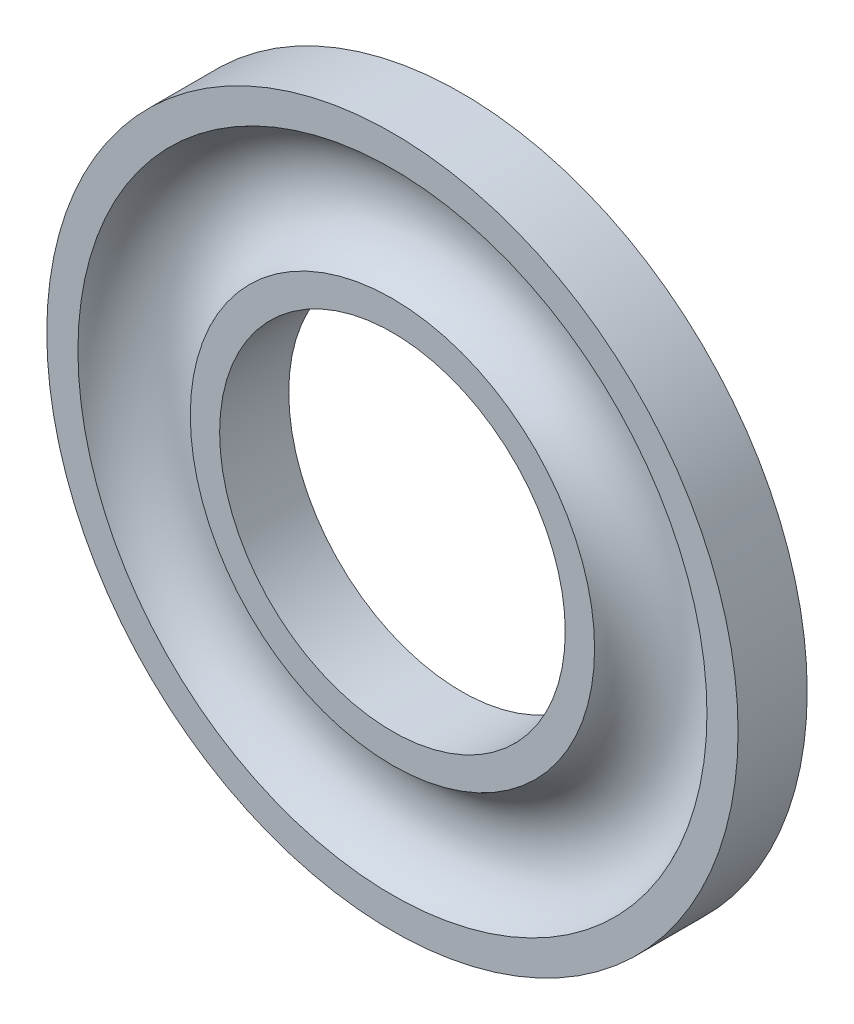
ISO-10303-21;
HEADER;
FILE_DESCRIPTION(('STEP AP214'),'2;1');
FILE_NAME('part.step','',(''),(''),'','','');
FILE_SCHEMA(('AUTOMOTIVE_DESIGN { 1 0 10303 214 1 1 1 1 }'));
ENDSEC;
DATA;
#1=APPLICATION_CONTEXT('core data for automotive mechanical design processes');
#2=APPLICATION_PROTOCOL_DEFINITION('international standard','automotive_design',2000,#1);
#3=PRODUCT_CONTEXT('',#1,'mechanical');
#4=PRODUCT('Part','Part','',(#3));
#5=PRODUCT_RELATED_PRODUCT_CATEGORY('part','',(#4));
#6=PRODUCT_DEFINITION_FORMATION('','',#4);
#7=PRODUCT_DEFINITION_CONTEXT('part definition',#1,'design');
#8=PRODUCT_DEFINITION('design','',#6,#7);
#9=PRODUCT_DEFINITION_SHAPE('','',#8);
#10=(LENGTH_UNIT() NAMED_UNIT(*) SI_UNIT(.MILLI.,.METRE.));
#11=(NAMED_UNIT(*) PLANE_ANGLE_UNIT() SI_UNIT($,.RADIAN.));
#12=(NAMED_UNIT(*) SI_UNIT($,.STERADIAN.) SOLID_ANGLE_UNIT());
#13=UNCERTAINTY_MEASURE_WITH_UNIT(LENGTH_MEASURE(1.E-05),#10,'distance_accuracy_value','');
#14=(GEOMETRIC_REPRESENTATION_CONTEXT(3) GLOBAL_UNCERTAINTY_ASSIGNED_CONTEXT((#13)) GLOBAL_UNIT_ASSIGNED_CONTEXT((#10,
#11,#12)) REPRESENTATION_CONTEXT('',''));
#15=CARTESIAN_POINT('',(0.,0.,0.));
#16=DIRECTION('',(0.,0.,1.));
#17=DIRECTION('',(1.,0.,0.));
#18=AXIS2_PLACEMENT_3D('',#15,#16,#17);
#19=CARTESIAN_POINT('',(0.,0.,4.));
#20=DIRECTION('',(0.,0.,1.));
#21=DIRECTION('',(1.,0.,0.));
#22=AXIS2_PLACEMENT_3D('',#19,#20,#21);
#23=PLANE('',#22);
#24=CARTESIAN_POINT('',(0.,0.,4.));
#25=DIRECTION('',(0.,0.,1.));
#26=DIRECTION('',(1.,0.,0.));
#27=AXIS2_PLACEMENT_3D('',#24,#25,#26);
#28=CIRCLE('',#27,20.);
#29=CARTESIAN_POINT('',(20.,0.,4.));
#30=VERTEX_POINT('',#29);
#31=EDGE_CURVE('E10',#30,#30,#28,.T.);
#32=ORIENTED_EDGE('',*,*,#31,.T.);
#33=EDGE_LOOP('',(#32));
#34=FACE_BOUND('',#33,.T.);
#35=CARTESIAN_POINT('',(0.,0.,4.));
#36=DIRECTION('',(0.,0.,1.));
#37=DIRECTION('',(1.,0.,0.));
#38=AXIS2_PLACEMENT_3D('',#35,#36,#37);
#39=CIRCLE('',#38,18.1993785005377);
#40=CARTESIAN_POINT('',(18.1993785005377,0.,4.));
#41=VERTEX_POINT('',#40);
#42=EDGE_CURVE('E33',#41,#41,#39,.F.);
#43=ORIENTED_EDGE('',*,*,#42,.T.);
#44=EDGE_LOOP('',(#43));
#45=FACE_BOUND('',#44,.T.);
#46=ADVANCED_FACE('F29',(#34,#45),#23,.T.);
#47=CARTESIAN_POINT('',(0.,0.,4.));
#48=DIRECTION('',(0.,0.,1.));
#49=DIRECTION('',(1.,0.,0.));
#50=AXIS2_PLACEMENT_3D('',#47,#48,#49);
#51=CIRCLE('',#50,10.);
#52=CARTESIAN_POINT('',(10.,0.,4.));
#53=VERTEX_POINT('',#52);
#54=EDGE_CURVE('E42',#53,#53,#51,.T.);
#55=ORIENTED_EDGE('',*,*,#54,.F.);
#56=EDGE_LOOP('',(#55));
#57=FACE_BOUND('',#56,.T.);
#58=CARTESIAN_POINT('',(0.,0.,4.));
#59=DIRECTION('',(0.,0.,-1.));
#60=DIRECTION('',(-1.,0.,0.));
#61=AXIS2_PLACEMENT_3D('',#58,#59,#60);
#62=CIRCLE('',#61,11.696195695362);
#63=CARTESIAN_POINT('',(-11.696195695362,0.,4.));
#64=VERTEX_POINT('',#63);
#65=EDGE_CURVE('E47',#64,#64,#62,.F.);
#66=ORIENTED_EDGE('',*,*,#65,.T.);
#67=EDGE_LOOP('',(#66));
#68=FACE_BOUND('',#67,.T.);
#69=ADVANCED_FACE('F63',(#57,#68),#23,.T.);
#70=CARTESIAN_POINT('',(0.,0.,0.));
#71=DIRECTION('',(0.,0.,1.));
#72=DIRECTION('',(1.,0.,0.));
#73=AXIS2_PLACEMENT_3D('',#70,#71,#72);
#74=PLANE('',#73);
#75=CARTESIAN_POINT('',(0.,0.,0.));
#76=DIRECTION('',(0.,0.,1.));
#77=DIRECTION('',(1.,0.,0.));
#78=AXIS2_PLACEMENT_3D('',#75,#76,#77);
#79=CIRCLE('',#78,20.);
#80=CARTESIAN_POINT('',(20.,0.,0.));
#81=VERTEX_POINT('',#80);
#82=EDGE_CURVE('E37',#81,#81,#79,.T.);
#83=ORIENTED_EDGE('',*,*,#82,.F.);
#84=EDGE_LOOP('',(#83));
#85=FACE_BOUND('',#84,.T.);
#86=CARTESIAN_POINT('',(0.,0.,0.));
#87=DIRECTION('',(0.,0.,1.));
#88=DIRECTION('',(1.,0.,0.));
#89=AXIS2_PLACEMENT_3D('',#86,#87,#88);
#90=CIRCLE('',#89,10.);
#91=CARTESIAN_POINT('',(10.,0.,0.));
#92=VERTEX_POINT('',#91);
#93=EDGE_CURVE('E45',#92,#92,#90,.T.);
#94=ORIENTED_EDGE('',*,*,#93,.T.);
#95=EDGE_LOOP('',(#94));
#96=FACE_BOUND('',#95,.T.);
#97=ADVANCED_FACE('F65',(#85,#96),#74,.F.);
#98=CARTESIAN_POINT('',(0.,0.,4.));
#99=DIRECTION('',(0.,0.,-1.));
#100=DIRECTION('',(-1.,0.,0.));
#101=AXIS2_PLACEMENT_3D('',#98,#99,#100);
#102=CYLINDRICAL_SURFACE('',#101,20.);
#103=ORIENTED_EDGE('',*,*,#31,.F.);
#104=EDGE_LOOP('',(#103));
#105=FACE_BOUND('',#104,.T.);
#106=ORIENTED_EDGE('',*,*,#82,.T.);
#107=EDGE_LOOP('',(#106));
#108=FACE_BOUND('',#107,.T.);
#109=ADVANCED_FACE('F31',(#105,#108),#102,.T.);
#110=CARTESIAN_POINT('',(0.,0.,4.));
#111=DIRECTION('',(0.,0.,-1.));
#112=DIRECTION('',(-1.,0.,0.));
#113=AXIS2_PLACEMENT_3D('',#110,#111,#112);
#114=CYLINDRICAL_SURFACE('',#113,10.);
#115=ORIENTED_EDGE('',*,*,#54,.T.);
#116=EDGE_LOOP('',(#115));
#117=FACE_BOUND('',#116,.T.);
#118=ORIENTED_EDGE('',*,*,#93,.F.);
#119=EDGE_LOOP('',(#118));
#120=FACE_BOUND('',#119,.T.);
#121=ADVANCED_FACE('F60',(#117,#120),#114,.F.);
#122=CARTESIAN_POINT('',(0.,0.,5.29504955527449));
#123=DIRECTION('',(0.,0.,-1.));
#124=DIRECTION('',(-1.,0.,0.));
#125=AXIS2_PLACEMENT_3D('',#122,#123,#124);
#126=TOROIDAL_SURFACE('',#125,14.9477870979498,3.5);
#127=ORIENTED_EDGE('',*,*,#42,.F.);
#128=EDGE_LOOP('',(#127));
#129=FACE_BOUND('',#128,.T.);
#130=ORIENTED_EDGE('',*,*,#65,.F.);
#131=EDGE_LOOP('',(#130));
#132=FACE_BOUND('',#131,.T.);
#133=ADVANCED_FACE('F75',(#129,#132),#126,.F.);
#134=CLOSED_SHELL('',(#46,#69,#97,#109,#121,#133));
#135=MANIFOLD_SOLID_BREP('B2',#134);
#136=ADVANCED_BREP_SHAPE_REPRESENTATION('',(#18,#135),#14);
#137=SHAPE_DEFINITION_REPRESENTATION(#9,#136);
ENDSEC;
END-ISO-10303-21;
